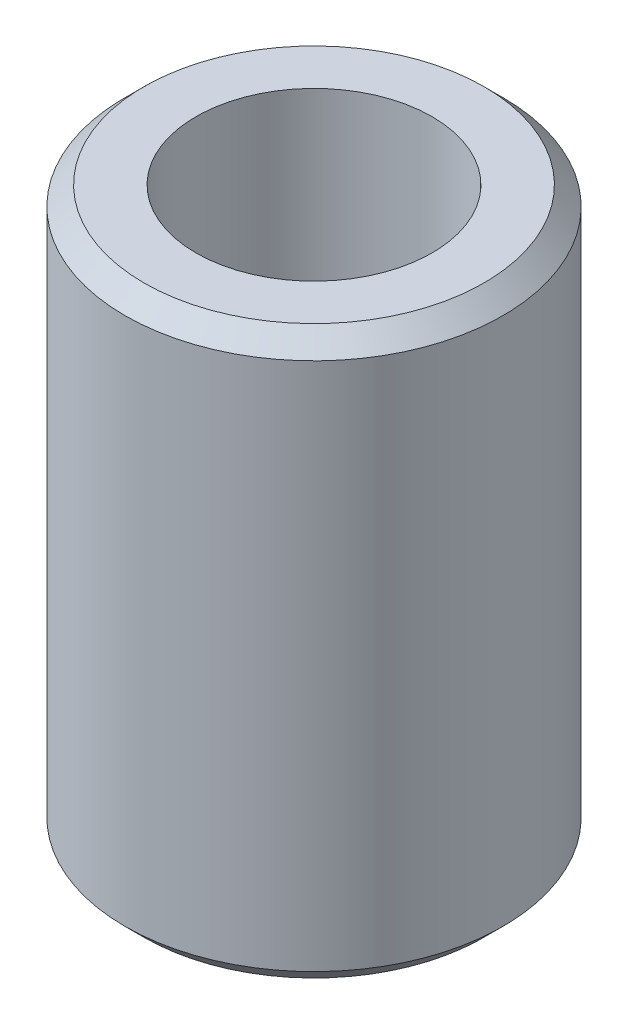
ISO-10303-21;
HEADER;
FILE_DESCRIPTION(('STEP AP214'),'2;1');
FILE_NAME('part.step','',(''),(''),'','','');
FILE_SCHEMA(('AUTOMOTIVE_DESIGN { 1 0 10303 214 1 1 1 1 }'));
ENDSEC;
DATA;
#1=APPLICATION_CONTEXT('core data for automotive mechanical design processes');
#2=APPLICATION_PROTOCOL_DEFINITION('international standard','automotive_design',2000,#1);
#3=PRODUCT_CONTEXT('',#1,'mechanical');
#4=PRODUCT('Part','Part','',(#3));
#5=PRODUCT_RELATED_PRODUCT_CATEGORY('part','',(#4));
#6=PRODUCT_DEFINITION_FORMATION('','',#4);
#7=PRODUCT_DEFINITION_CONTEXT('part definition',#1,'design');
#8=PRODUCT_DEFINITION('design','',#6,#7);
#9=PRODUCT_DEFINITION_SHAPE('','',#8);
#10=(LENGTH_UNIT() NAMED_UNIT(*) SI_UNIT(.MILLI.,.METRE.));
#11=(NAMED_UNIT(*) PLANE_ANGLE_UNIT() SI_UNIT($,.RADIAN.));
#12=(NAMED_UNIT(*) SI_UNIT($,.STERADIAN.) SOLID_ANGLE_UNIT());
#13=UNCERTAINTY_MEASURE_WITH_UNIT(LENGTH_MEASURE(1.E-05),#10,'distance_accuracy_value','');
#14=(GEOMETRIC_REPRESENTATION_CONTEXT(3) GLOBAL_UNCERTAINTY_ASSIGNED_CONTEXT((#13)) GLOBAL_UNIT_ASSIGNED_CONTEXT((#10,
#11,#12)) REPRESENTATION_CONTEXT('',''));
#15=CARTESIAN_POINT('',(0.,0.,0.));
#16=DIRECTION('',(0.,0.,1.));
#17=DIRECTION('',(1.,0.,0.));
#18=AXIS2_PLACEMENT_3D('',#15,#16,#17);
#19=CARTESIAN_POINT('',(0.,30.,0.));
#20=DIRECTION('',(0.,1.,0.));
#21=DIRECTION('',(0.,0.,1.));
#22=AXIS2_PLACEMENT_3D('',#19,#20,#21);
#23=PLANE('',#22);
#24=CARTESIAN_POINT('',(0.,30.,0.));
#25=DIRECTION('',(0.,1.,0.));
#26=DIRECTION('',(0.,0.,1.));
#27=AXIS2_PLACEMENT_3D('',#24,#25,#26);
#28=CIRCLE('',#27,18.);
#29=CARTESIAN_POINT('',(0.,30.,18.));
#30=VERTEX_POINT('',#29);
#31=EDGE_CURVE('E10',#30,#30,#28,.T.);
#32=ORIENTED_EDGE('',*,*,#31,.T.);
#33=EDGE_LOOP('',(#32));
#34=FACE_BOUND('',#33,.T.);
#35=CARTESIAN_POINT('',(0.,30.,0.));
#36=DIRECTION('',(0.,1.,0.));
#37=DIRECTION('',(0.,0.,1.));
#38=AXIS2_PLACEMENT_3D('',#35,#36,#37);
#39=CIRCLE('',#38,12.5);
#40=CARTESIAN_POINT('',(0.,30.,12.5));
#41=VERTEX_POINT('',#40);
#42=EDGE_CURVE('E60',#41,#41,#39,.T.);
#43=ORIENTED_EDGE('',*,*,#42,.F.);
#44=EDGE_LOOP('',(#43));
#45=FACE_BOUND('',#44,.T.);
#46=ADVANCED_FACE('F39',(#34,#45),#23,.T.);
#47=CARTESIAN_POINT('',(0.,-30.,0.));
#48=DIRECTION('',(0.,1.,0.));
#49=DIRECTION('',(0.,0.,1.));
#50=AXIS2_PLACEMENT_3D('',#47,#48,#49);
#51=PLANE('',#50);
#52=CARTESIAN_POINT('',(0.,-30.,0.));
#53=DIRECTION('',(0.,1.,0.));
#54=DIRECTION('',(0.,0.,1.));
#55=AXIS2_PLACEMENT_3D('',#52,#53,#54);
#56=CIRCLE('',#55,18.);
#57=CARTESIAN_POINT('',(0.,-30.,18.));
#58=VERTEX_POINT('',#57);
#59=EDGE_CURVE('E47',#58,#58,#56,.F.);
#60=ORIENTED_EDGE('',*,*,#59,.T.);
#61=EDGE_LOOP('',(#60));
#62=FACE_BOUND('',#61,.T.);
#63=CARTESIAN_POINT('',(0.,-30.,0.));
#64=DIRECTION('',(0.,1.,0.));
#65=DIRECTION('',(0.,0.,1.));
#66=AXIS2_PLACEMENT_3D('',#63,#64,#65);
#67=CIRCLE('',#66,12.5);
#68=CARTESIAN_POINT('',(0.,-30.,12.5));
#69=VERTEX_POINT('',#68);
#70=EDGE_CURVE('E61',#69,#69,#67,.T.);
#71=ORIENTED_EDGE('',*,*,#70,.T.);
#72=EDGE_LOOP('',(#71));
#73=FACE_BOUND('',#72,.T.);
#74=ADVANCED_FACE('F71',(#62,#73),#51,.F.);
#75=CARTESIAN_POINT('',(0.,30.,0.));
#76=DIRECTION('',(0.,-1.,0.));
#77=DIRECTION('',(0.,0.,-1.));
#78=AXIS2_PLACEMENT_3D('',#75,#76,#77);
#79=CYLINDRICAL_SURFACE('',#78,20.);
#80=CARTESIAN_POINT('',(0.,-28.,0.));
#81=DIRECTION('',(0.,1.,0.));
#82=DIRECTION('',(0.,0.,1.));
#83=AXIS2_PLACEMENT_3D('',#80,#81,#82);
#84=CIRCLE('',#83,20.);
#85=CARTESIAN_POINT('',(0.,-28.,20.));
#86=VERTEX_POINT('',#85);
#87=EDGE_CURVE('E51',#86,#86,#84,.T.);
#88=ORIENTED_EDGE('',*,*,#87,.T.);
#89=EDGE_LOOP('',(#88));
#90=FACE_BOUND('',#89,.T.);
#91=CARTESIAN_POINT('',(0.,28.,0.));
#92=DIRECTION('',(0.,1.,0.));
#93=DIRECTION('',(0.,0.,1.));
#94=AXIS2_PLACEMENT_3D('',#91,#92,#93);
#95=CIRCLE('',#94,20.);
#96=CARTESIAN_POINT('',(0.,28.,20.));
#97=VERTEX_POINT('',#96);
#98=EDGE_CURVE('E55',#97,#97,#95,.F.);
#99=ORIENTED_EDGE('',*,*,#98,.T.);
#100=EDGE_LOOP('',(#99));
#101=FACE_BOUND('',#100,.T.);
#102=ADVANCED_FACE('F77',(#90,#101),#79,.T.);
#103=CARTESIAN_POINT('',(0.,30.,0.));
#104=DIRECTION('',(0.,-1.,0.));
#105=DIRECTION('',(0.,0.,-1.));
#106=AXIS2_PLACEMENT_3D('',#103,#104,#105);
#107=CYLINDRICAL_SURFACE('',#106,12.5);
#108=ORIENTED_EDGE('',*,*,#42,.T.);
#109=EDGE_LOOP('',(#108));
#110=FACE_BOUND('',#109,.T.);
#111=ORIENTED_EDGE('',*,*,#70,.F.);
#112=EDGE_LOOP('',(#111));
#113=FACE_BOUND('',#112,.T.);
#114=ADVANCED_FACE('F67',(#110,#113),#107,.F.);
#115=CARTESIAN_POINT('',(0.,-28.,0.));
#116=DIRECTION('',(0.,1.,0.));
#117=DIRECTION('',(0.,0.,1.));
#118=AXIS2_PLACEMENT_3D('',#115,#116,#117);
#119=CONICAL_SURFACE('',#118,20.,0.785398163397451);
#120=ORIENTED_EDGE('',*,*,#59,.F.);
#121=EDGE_LOOP('',(#120));
#122=FACE_BOUND('',#121,.T.);
#123=ORIENTED_EDGE('',*,*,#87,.F.);
#124=EDGE_LOOP('',(#123));
#125=FACE_BOUND('',#124,.T.);
#126=ADVANCED_FACE('F84',(#122,#125),#119,.T.);
#127=CARTESIAN_POINT('',(0.,30.,0.));
#128=DIRECTION('',(0.,-1.,0.));
#129=DIRECTION('',(0.,0.,-1.));
#130=AXIS2_PLACEMENT_3D('',#127,#128,#129);
#131=CONICAL_SURFACE('',#130,18.,0.785398163397448);
#132=ORIENTED_EDGE('',*,*,#98,.F.);
#133=EDGE_LOOP('',(#132));
#134=FACE_BOUND('',#133,.T.);
#135=ORIENTED_EDGE('',*,*,#31,.F.);
#136=EDGE_LOOP('',(#135));
#137=FACE_BOUND('',#136,.T.);
#138=ADVANCED_FACE('F42',(#134,#137),#131,.T.);
#139=CLOSED_SHELL('',(#46,#74,#102,#114,#126,#138));
#140=MANIFOLD_SOLID_BREP('B2',#139);
#141=ADVANCED_BREP_SHAPE_REPRESENTATION('',(#18,#140),#14);
#142=SHAPE_DEFINITION_REPRESENTATION(#9,#141);
ENDSEC;
END-ISO-10303-21;
